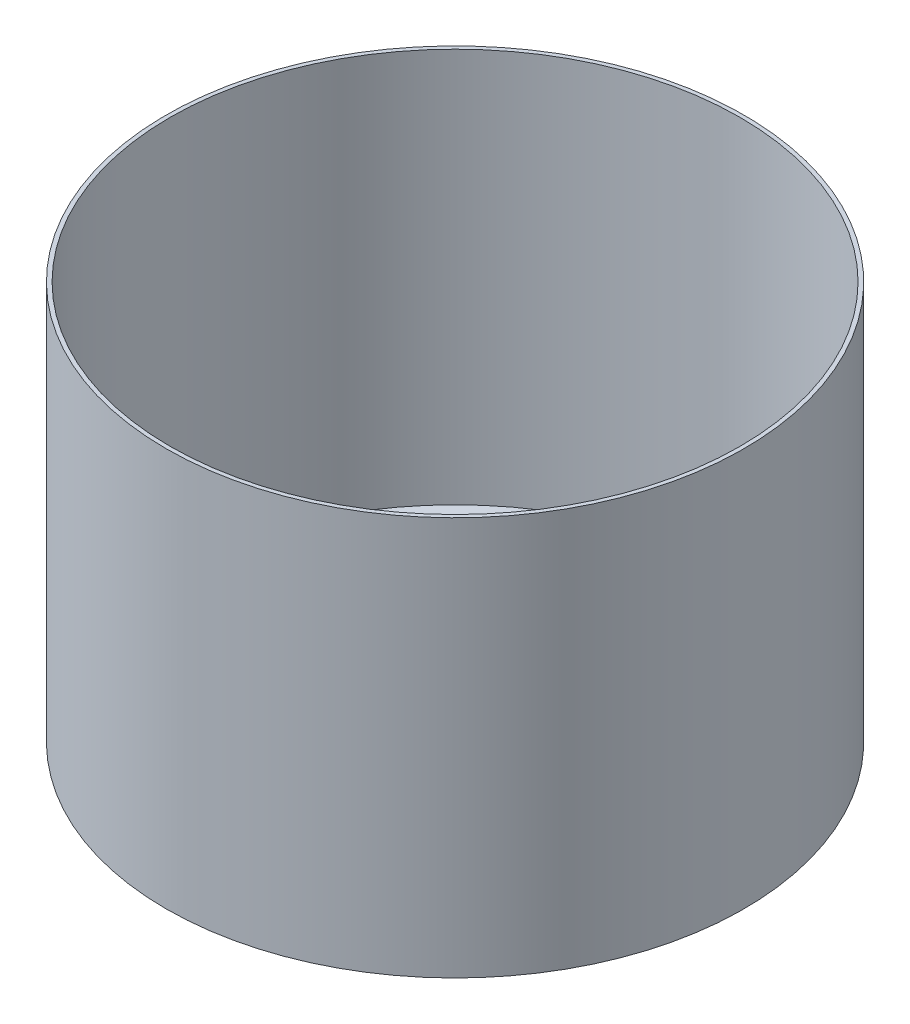
ISO-10303-21;
HEADER;
FILE_DESCRIPTION(('STEP AP214'),'2;1');
FILE_NAME('part.step','',(''),(''),'','','');
FILE_SCHEMA(('AUTOMOTIVE_DESIGN { 1 0 10303 214 1 1 1 1 }'));
ENDSEC;
DATA;
#1=APPLICATION_CONTEXT('core data for automotive mechanical design processes');
#2=APPLICATION_PROTOCOL_DEFINITION('international standard','automotive_design',2000,#1);
#3=PRODUCT_CONTEXT('',#1,'mechanical');
#4=PRODUCT('Part','Part','',(#3));
#5=PRODUCT_RELATED_PRODUCT_CATEGORY('part','',(#4));
#6=PRODUCT_DEFINITION_FORMATION('','',#4);
#7=PRODUCT_DEFINITION_CONTEXT('part definition',#1,'design');
#8=PRODUCT_DEFINITION('design','',#6,#7);
#9=PRODUCT_DEFINITION_SHAPE('','',#8);
#10=(LENGTH_UNIT() NAMED_UNIT(*) SI_UNIT(.MILLI.,.METRE.));
#11=(NAMED_UNIT(*) PLANE_ANGLE_UNIT() SI_UNIT($,.RADIAN.));
#12=(NAMED_UNIT(*) SI_UNIT($,.STERADIAN.) SOLID_ANGLE_UNIT());
#13=UNCERTAINTY_MEASURE_WITH_UNIT(LENGTH_MEASURE(1.E-05),#10,'distance_accuracy_value','');
#14=(GEOMETRIC_REPRESENTATION_CONTEXT(3) GLOBAL_UNCERTAINTY_ASSIGNED_CONTEXT((#13)) GLOBAL_UNIT_ASSIGNED_CONTEXT((#10,
#11,#12)) REPRESENTATION_CONTEXT('',''));
#15=CARTESIAN_POINT('',(0.,0.,0.));
#16=DIRECTION('',(0.,0.,1.));
#17=DIRECTION('',(1.,0.,0.));
#18=AXIS2_PLACEMENT_3D('',#15,#16,#17);
#19=CARTESIAN_POINT('',(0.,1.,5.));
#20=DIRECTION('',(0.,-1.,0.));
#21=DIRECTION('',(0.,0.,-1.));
#22=AXIS2_PLACEMENT_3D('',#19,#20,#21);
#23=CYLINDRICAL_SURFACE('',#22,2.);
#24=CARTESIAN_POINT('',(0.,1.,5.));
#25=DIRECTION('',(0.,1.,0.));
#26=DIRECTION('',(0.,0.,1.));
#27=AXIS2_PLACEMENT_3D('',#24,#25,#26);
#28=CIRCLE('',#27,2.);
#29=CARTESIAN_POINT('',(0.,1.,7.));
#30=VERTEX_POINT('',#29);
#31=EDGE_CURVE('E10',#30,#30,#28,.T.);
#32=ORIENTED_EDGE('',*,*,#31,.T.);
#33=EDGE_LOOP('',(#32));
#34=FACE_BOUND('',#33,.T.);
#35=CARTESIAN_POINT('',(0.,0.,5.));
#36=DIRECTION('',(0.,1.,0.));
#37=DIRECTION('',(0.,0.,1.));
#38=AXIS2_PLACEMENT_3D('',#35,#36,#37);
#39=CIRCLE('',#38,2.);
#40=CARTESIAN_POINT('',(0.,0.,7.));
#41=VERTEX_POINT('',#40);
#42=EDGE_CURVE('E35',#41,#41,#39,.T.);
#43=ORIENTED_EDGE('',*,*,#42,.F.);
#44=EDGE_LOOP('',(#43));
#45=FACE_BOUND('',#44,.T.);
#46=ADVANCED_FACE('F31',(#34,#45),#23,.F.);
#47=CARTESIAN_POINT('',(-5.,1.,0.));
#48=DIRECTION('',(0.,-1.,0.));
#49=DIRECTION('',(0.,0.,-1.));
#50=AXIS2_PLACEMENT_3D('',#47,#48,#49);
#51=CYLINDRICAL_SURFACE('',#50,2.);
#52=CARTESIAN_POINT('',(-5.,1.,0.));
#53=DIRECTION('',(0.,1.,0.));
#54=DIRECTION('',(0.,0.,1.));
#55=AXIS2_PLACEMENT_3D('',#52,#53,#54);
#56=CIRCLE('',#55,2.);
#57=CARTESIAN_POINT('',(-5.,1.,2.));
#58=VERTEX_POINT('',#57);
#59=EDGE_CURVE('E39',#58,#58,#56,.T.);
#60=ORIENTED_EDGE('',*,*,#59,.T.);
#61=EDGE_LOOP('',(#60));
#62=FACE_BOUND('',#61,.T.);
#63=CARTESIAN_POINT('',(-5.,0.,0.));
#64=DIRECTION('',(0.,1.,0.));
#65=DIRECTION('',(0.,0.,1.));
#66=AXIS2_PLACEMENT_3D('',#63,#64,#65);
#67=CIRCLE('',#66,2.);
#68=CARTESIAN_POINT('',(-5.,0.,2.));
#69=VERTEX_POINT('',#68);
#70=EDGE_CURVE('E54',#69,#69,#67,.T.);
#71=ORIENTED_EDGE('',*,*,#70,.F.);
#72=EDGE_LOOP('',(#71));
#73=FACE_BOUND('',#72,.T.);
#74=ADVANCED_FACE('F110',(#62,#73),#51,.F.);
#75=CARTESIAN_POINT('',(5.,1.,0.));
#76=DIRECTION('',(0.,-1.,0.));
#77=DIRECTION('',(0.,0.,-1.));
#78=AXIS2_PLACEMENT_3D('',#75,#76,#77);
#79=CYLINDRICAL_SURFACE('',#78,2.);
#80=CARTESIAN_POINT('',(5.,1.,0.));
#81=DIRECTION('',(0.,1.,0.));
#82=DIRECTION('',(0.,0.,1.));
#83=AXIS2_PLACEMENT_3D('',#80,#81,#82);
#84=CIRCLE('',#83,2.);
#85=CARTESIAN_POINT('',(5.,1.,2.));
#86=VERTEX_POINT('',#85);
#87=EDGE_CURVE('E44',#86,#86,#84,.F.);
#88=ORIENTED_EDGE('',*,*,#87,.F.);
#89=EDGE_LOOP('',(#88));
#90=FACE_BOUND('',#89,.T.);
#91=CARTESIAN_POINT('',(5.,0.,0.));
#92=DIRECTION('',(0.,1.,0.));
#93=DIRECTION('',(0.,0.,1.));
#94=AXIS2_PLACEMENT_3D('',#91,#92,#93);
#95=CIRCLE('',#94,2.);
#96=CARTESIAN_POINT('',(5.,0.,2.));
#97=VERTEX_POINT('',#96);
#98=EDGE_CURVE('E51',#97,#97,#95,.F.);
#99=ORIENTED_EDGE('',*,*,#98,.T.);
#100=EDGE_LOOP('',(#99));
#101=FACE_BOUND('',#100,.T.);
#102=ADVANCED_FACE('F114',(#90,#101),#79,.F.);
#103=CARTESIAN_POINT('',(0.,1.,-5.));
#104=DIRECTION('',(0.,-1.,0.));
#105=DIRECTION('',(0.,0.,-1.));
#106=AXIS2_PLACEMENT_3D('',#103,#104,#105);
#107=CYLINDRICAL_SURFACE('',#106,2.);
#108=CARTESIAN_POINT('',(0.,1.,-5.));
#109=DIRECTION('',(0.,1.,0.));
#110=DIRECTION('',(0.,0.,1.));
#111=AXIS2_PLACEMENT_3D('',#108,#109,#110);
#112=CIRCLE('',#111,2.);
#113=CARTESIAN_POINT('',(0.,1.,-3.));
#114=VERTEX_POINT('',#113);
#115=EDGE_CURVE('E59',#114,#114,#112,.T.);
#116=ORIENTED_EDGE('',*,*,#115,.T.);
#117=EDGE_LOOP('',(#116));
#118=FACE_BOUND('',#117,.T.);
#119=CARTESIAN_POINT('',(0.,0.,-5.));
#120=DIRECTION('',(0.,1.,0.));
#121=DIRECTION('',(0.,0.,1.));
#122=AXIS2_PLACEMENT_3D('',#119,#120,#121);
#123=CIRCLE('',#122,2.);
#124=CARTESIAN_POINT('',(0.,0.,-3.));
#125=VERTEX_POINT('',#124);
#126=EDGE_CURVE('E48',#125,#125,#123,.T.);
#127=ORIENTED_EDGE('',*,*,#126,.F.);
#128=EDGE_LOOP('',(#127));
#129=FACE_BOUND('',#128,.T.);
#130=ADVANCED_FACE('F33',(#118,#129),#107,.F.);
#131=CARTESIAN_POINT('',(0.,1.,0.));
#132=DIRECTION('',(0.,1.,0.));
#133=DIRECTION('',(0.,0.,1.));
#134=AXIS2_PLACEMENT_3D('',#131,#132,#133);
#135=PLANE('',#134);
#136=ORIENTED_EDGE('',*,*,#115,.F.);
#137=EDGE_LOOP('',(#136));
#138=FACE_BOUND('',#137,.T.);
#139=ORIENTED_EDGE('',*,*,#87,.T.);
#140=EDGE_LOOP('',(#139));
#141=FACE_BOUND('',#140,.T.);
#142=ORIENTED_EDGE('',*,*,#59,.F.);
#143=EDGE_LOOP('',(#142));
#144=FACE_BOUND('',#143,.T.);
#145=ORIENTED_EDGE('',*,*,#31,.F.);
#146=EDGE_LOOP('',(#145));
#147=FACE_BOUND('',#146,.T.);
#148=CARTESIAN_POINT('',(0.,1.,0.));
#149=DIRECTION('',(0.,1.,0.));
#150=DIRECTION('',(0.,0.,1.));
#151=AXIS2_PLACEMENT_3D('',#148,#149,#150);
#152=CIRCLE('',#151,71.5);
#153=CARTESIAN_POINT('',(0.,1.,71.5));
#154=VERTEX_POINT('',#153);
#155=EDGE_CURVE('E52',#154,#154,#152,.F.);
#156=ORIENTED_EDGE('',*,*,#155,.F.);
#157=EDGE_LOOP('',(#156));
#158=FACE_BOUND('',#157,.T.);
#159=ADVANCED_FACE('F96',(#138,#141,#144,#147,#158),#135,.T.);
#160=CARTESIAN_POINT('',(0.,0.,0.));
#161=DIRECTION('',(0.,1.,0.));
#162=DIRECTION('',(0.,0.,1.));
#163=AXIS2_PLACEMENT_3D('',#160,#161,#162);
#164=PLANE('',#163);
#165=ORIENTED_EDGE('',*,*,#126,.T.);
#166=EDGE_LOOP('',(#165));
#167=FACE_BOUND('',#166,.T.);
#168=ORIENTED_EDGE('',*,*,#98,.F.);
#169=EDGE_LOOP('',(#168));
#170=FACE_BOUND('',#169,.T.);
#171=ORIENTED_EDGE('',*,*,#70,.T.);
#172=EDGE_LOOP('',(#171));
#173=FACE_BOUND('',#172,.T.);
#174=ORIENTED_EDGE('',*,*,#42,.T.);
#175=EDGE_LOOP('',(#174));
#176=FACE_BOUND('',#175,.T.);
#177=CARTESIAN_POINT('',(0.,0.,0.));
#178=DIRECTION('',(0.,1.,0.));
#179=DIRECTION('',(0.,0.,1.));
#180=AXIS2_PLACEMENT_3D('',#177,#178,#179);
#181=CIRCLE('',#180,72.5);
#182=CARTESIAN_POINT('',(0.,0.,72.5));
#183=VERTEX_POINT('',#182);
#184=EDGE_CURVE('E71',#183,#183,#181,.T.);
#185=ORIENTED_EDGE('',*,*,#184,.F.);
#186=EDGE_LOOP('',(#185));
#187=FACE_BOUND('',#186,.T.);
#188=ADVANCED_FACE('F94',(#167,#170,#173,#176,#187),#164,.F.);
#189=CARTESIAN_POINT('',(0.,100.,0.));
#190=DIRECTION('',(0.,-1.,0.));
#191=DIRECTION('',(0.,0.,-1.));
#192=AXIS2_PLACEMENT_3D('',#189,#190,#191);
#193=CYLINDRICAL_SURFACE('',#192,71.5);
#194=ORIENTED_EDGE('',*,*,#155,.T.);
#195=EDGE_LOOP('',(#194));
#196=FACE_BOUND('',#195,.T.);
#197=CARTESIAN_POINT('',(0.,100.,0.));
#198=DIRECTION('',(0.,1.,0.));
#199=DIRECTION('',(0.,0.,1.));
#200=AXIS2_PLACEMENT_3D('',#197,#198,#199);
#201=CIRCLE('',#200,71.5);
#202=CARTESIAN_POINT('',(0.,100.,71.5));
#203=VERTEX_POINT('',#202);
#204=EDGE_CURVE('E74',#203,#203,#201,.T.);
#205=ORIENTED_EDGE('',*,*,#204,.T.);
#206=EDGE_LOOP('',(#205));
#207=FACE_BOUND('',#206,.T.);
#208=ADVANCED_FACE('F80',(#196,#207),#193,.F.);
#209=CARTESIAN_POINT('',(0.,100.,0.));
#210=DIRECTION('',(0.,-1.,0.));
#211=DIRECTION('',(0.,0.,-1.));
#212=AXIS2_PLACEMENT_3D('',#209,#210,#211);
#213=CYLINDRICAL_SURFACE('',#212,72.5);
#214=CARTESIAN_POINT('',(0.,100.,0.));
#215=DIRECTION('',(0.,1.,0.));
#216=DIRECTION('',(0.,0.,1.));
#217=AXIS2_PLACEMENT_3D('',#214,#215,#216);
#218=CIRCLE('',#217,72.5);
#219=CARTESIAN_POINT('',(0.,100.,72.5));
#220=VERTEX_POINT('',#219);
#221=EDGE_CURVE('E70',#220,#220,#218,.T.);
#222=ORIENTED_EDGE('',*,*,#221,.F.);
#223=EDGE_LOOP('',(#222));
#224=FACE_BOUND('',#223,.T.);
#225=ORIENTED_EDGE('',*,*,#184,.T.);
#226=EDGE_LOOP('',(#225));
#227=FACE_BOUND('',#226,.T.);
#228=ADVANCED_FACE('F85',(#224,#227),#213,.T.);
#229=CARTESIAN_POINT('',(0.,100.,0.));
#230=DIRECTION('',(0.,1.,0.));
#231=DIRECTION('',(0.,0.,1.));
#232=AXIS2_PLACEMENT_3D('',#229,#230,#231);
#233=PLANE('',#232);
#234=ORIENTED_EDGE('',*,*,#204,.F.);
#235=EDGE_LOOP('',(#234));
#236=FACE_BOUND('',#235,.T.);
#237=ORIENTED_EDGE('',*,*,#221,.T.);
#238=EDGE_LOOP('',(#237));
#239=FACE_BOUND('',#238,.T.);
#240=ADVANCED_FACE('F82',(#236,#239),#233,.T.);
#241=CLOSED_SHELL('',(#46,#74,#102,#130,#159,#188,#208,#228,#240));
#242=MANIFOLD_SOLID_BREP('B2',#241);
#243=ADVANCED_BREP_SHAPE_REPRESENTATION('',(#18,#242),#14);
#244=SHAPE_DEFINITION_REPRESENTATION(#9,#243);
ENDSEC;
END-ISO-10303-21;
